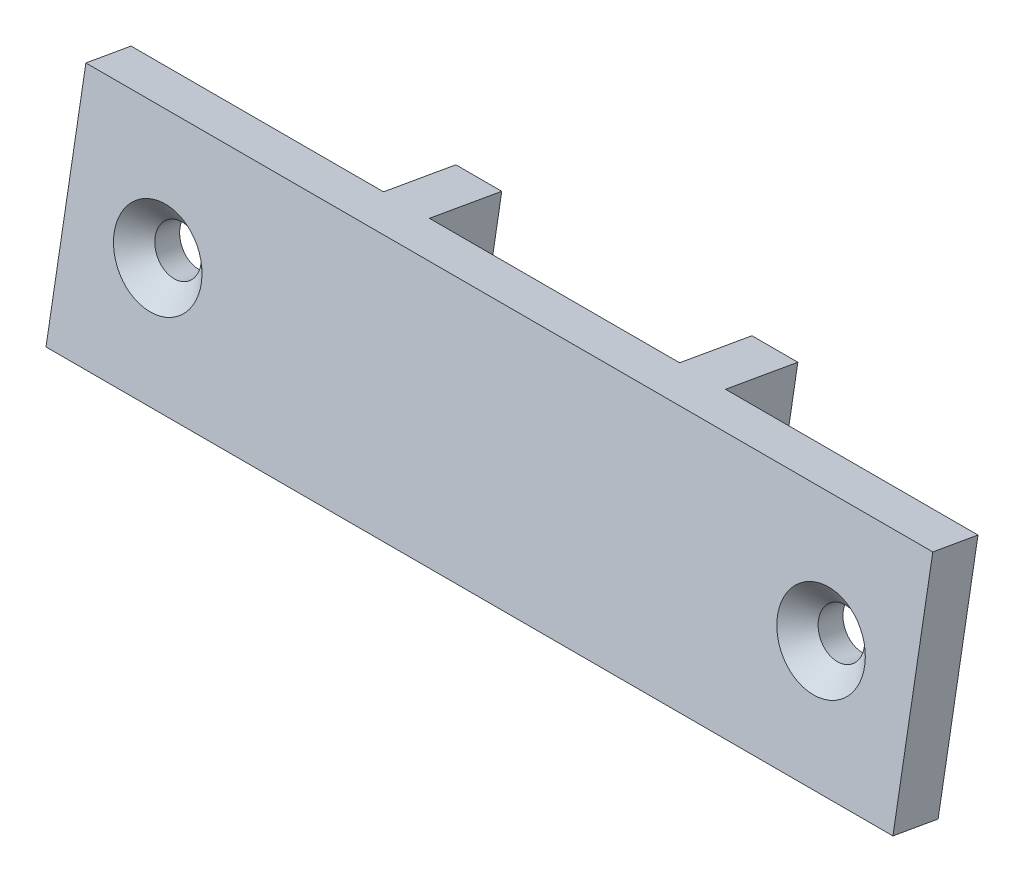
ISO-10303-21;
HEADER;
FILE_DESCRIPTION(('STEP AP214'),'2;1');
FILE_NAME('part.step','',(''),(''),'','','');
FILE_SCHEMA(('AUTOMOTIVE_DESIGN { 1 0 10303 214 1 1 1 1 }'));
ENDSEC;
DATA;
#1=APPLICATION_CONTEXT('core data for automotive mechanical design processes');
#2=APPLICATION_PROTOCOL_DEFINITION('international standard','automotive_design',2000,#1);
#3=PRODUCT_CONTEXT('',#1,'mechanical');
#4=PRODUCT('Part','Part','',(#3));
#5=PRODUCT_RELATED_PRODUCT_CATEGORY('part','',(#4));
#6=PRODUCT_DEFINITION_FORMATION('','',#4);
#7=PRODUCT_DEFINITION_CONTEXT('part definition',#1,'design');
#8=PRODUCT_DEFINITION('design','',#6,#7);
#9=PRODUCT_DEFINITION_SHAPE('','',#8);
#10=(LENGTH_UNIT() NAMED_UNIT(*) SI_UNIT(.MILLI.,.METRE.));
#11=(NAMED_UNIT(*) PLANE_ANGLE_UNIT() SI_UNIT($,.RADIAN.));
#12=(NAMED_UNIT(*) SI_UNIT($,.STERADIAN.) SOLID_ANGLE_UNIT());
#13=UNCERTAINTY_MEASURE_WITH_UNIT(LENGTH_MEASURE(1.E-05),#10,'distance_accuracy_value','');
#14=(GEOMETRIC_REPRESENTATION_CONTEXT(3) GLOBAL_UNCERTAINTY_ASSIGNED_CONTEXT((#13)) GLOBAL_UNIT_ASSIGNED_CONTEXT((#10,
#11,#12)) REPRESENTATION_CONTEXT('',''));
#15=CARTESIAN_POINT('',(0.,0.,0.));
#16=DIRECTION('',(0.,0.,1.));
#17=DIRECTION('',(1.,0.,0.));
#18=AXIS2_PLACEMENT_3D('',#15,#16,#17);
#19=CARTESIAN_POINT('',(0.,-1.36313819468535,-7.73074086114584));
#20=DIRECTION('',(0.,0.173648177666923,0.984807753012209));
#21=DIRECTION('',(0.,-0.984807753012209,0.173648177666923));
#22=AXIS2_PLACEMENT_3D('',#19,#20,#21);
#23=PLANE('',#22);
#24=CARTESIAN_POINT('',(14.45,-9.6355233199879,-6.27209616874369));
#25=DIRECTION('',(0.,0.173648177666923,0.984807753012209));
#26=DIRECTION('',(0.,-0.984807753012209,0.173648177666923));
#27=AXIS2_PLACEMENT_3D('',#24,#25,#26);
#28=CIRCLE('',#27,1.);
#29=CARTESIAN_POINT('',(14.45,-10.6203310730001,-6.09844799107677));
#30=VERTEX_POINT('',#29);
#31=EDGE_CURVE('E197',#30,#30,#28,.T.);
#32=ORIENTED_EDGE('',*,*,#31,.T.);
#33=EDGE_LOOP('',(#32));
#34=FACE_BOUND('',#33,.T.);
#35=DIRECTION('',(0.,-0.984807753012209,0.173648177666923));
#36=VECTOR('',#35,1.);
#37=CARTESIAN_POINT('',(7.45,-4.71148455492685,-7.14033705707831));
#38=LINE('',#37,#36);
#39=CARTESIAN_POINT('',(7.45,-4.71148455492685,-7.14033705707831));
#40=VERTEX_POINT('',#39);
#41=CARTESIAN_POINT('',(7.45,-14.5595620850489,-5.40385528040907));
#42=VERTEX_POINT('',#41);
#43=EDGE_CURVE('E162',#40,#42,#38,.T.);
#44=ORIENTED_EDGE('',*,*,#43,.F.);
#45=DIRECTION('',(-1.,0.,0.));
#46=VECTOR('',#45,1.);
#47=CARTESIAN_POINT('',(-18.45,-4.71148455492685,-7.14033705707831));
#48=LINE('',#47,#46);
#49=CARTESIAN_POINT('',(18.45,-4.71148455492685,-7.14033705707831));
#50=VERTEX_POINT('',#49);
#51=EDGE_CURVE('E214',#50,#40,#48,.T.);
#52=ORIENTED_EDGE('',*,*,#51,.F.);
#53=DIRECTION('',(0.,0.984807753012209,-0.173648177666923));
#54=VECTOR('',#53,1.);
#55=CARTESIAN_POINT('',(18.45,-4.71148455492685,-7.14033705707831));
#56=LINE('',#55,#54);
#57=CARTESIAN_POINT('',(18.45,-14.5595620850489,-5.40385528040907));
#58=VERTEX_POINT('',#57);
#59=EDGE_CURVE('E209',#58,#50,#56,.T.);
#60=ORIENTED_EDGE('',*,*,#59,.F.);
#61=DIRECTION('',(1.,0.,0.));
#62=VECTOR('',#61,1.);
#63=CARTESIAN_POINT('',(-18.45,-14.5595620850489,-5.40385528040907));
#64=LINE('',#63,#62);
#65=EDGE_CURVE('E57',#42,#58,#64,.T.);
#66=ORIENTED_EDGE('',*,*,#65,.F.);
#67=EDGE_LOOP('',(#44,#52,#60,#66));
#68=FACE_BOUND('',#67,.T.);
#69=ADVANCED_FACE('F41',(#34,#68),#23,.F.);
#70=DIRECTION('',(0.,0.984807753012209,-0.173648177666923));
#71=VECTOR('',#70,1.);
#72=CARTESIAN_POINT('',(5.45,-4.71148455492685,-7.14033705707831));
#73=LINE('',#72,#71);
#74=CARTESIAN_POINT('',(5.45,-14.5595620850489,-5.40385528040907));
#75=VERTEX_POINT('',#74);
#76=CARTESIAN_POINT('',(5.45,-4.71148455492685,-7.14033705707831));
#77=VERTEX_POINT('',#76);
#78=EDGE_CURVE('E65',#75,#77,#73,.T.);
#79=ORIENTED_EDGE('',*,*,#78,.F.);
#80=CARTESIAN_POINT('',(-5.45,-14.559562085049,-5.40385528040908));
#81=VERTEX_POINT('',#80);
#82=EDGE_CURVE('E210',#81,#75,#64,.T.);
#83=ORIENTED_EDGE('',*,*,#82,.F.);
#84=DIRECTION('',(0.,-0.984807753012209,0.173648177666923));
#85=VECTOR('',#84,1.);
#86=CARTESIAN_POINT('',(-5.45,-14.559562085049,-5.40385528040908));
#87=LINE('',#86,#85);
#88=CARTESIAN_POINT('',(-5.45,-4.71148455492685,-7.14033705707831));
#89=VERTEX_POINT('',#88);
#90=EDGE_CURVE('E178',#89,#81,#87,.T.);
#91=ORIENTED_EDGE('',*,*,#90,.F.);
#92=EDGE_CURVE('E216',#77,#89,#48,.T.);
#93=ORIENTED_EDGE('',*,*,#92,.F.);
#94=EDGE_LOOP('',(#79,#83,#91,#93));
#95=FACE_BOUND('',#94,.T.);
#96=ADVANCED_FACE('F255',(#95),#23,.F.);
#97=CARTESIAN_POINT('',(-14.45,-9.6355233199879,-6.27209616874369));
#98=DIRECTION('',(0.,0.173648177666923,0.984807753012209));
#99=DIRECTION('',(0.,-0.984807753012209,0.173648177666923));
#100=AXIS2_PLACEMENT_3D('',#97,#98,#99);
#101=CIRCLE('',#100,1.);
#102=CARTESIAN_POINT('',(-14.45,-10.6203310730001,-6.09844799107677));
#103=VERTEX_POINT('',#102);
#104=EDGE_CURVE('E278',#103,#103,#101,.F.);
#105=ORIENTED_EDGE('',*,*,#104,.F.);
#106=EDGE_LOOP('',(#105));
#107=FACE_BOUND('',#106,.T.);
#108=DIRECTION('',(0.,0.984807753012209,-0.173648177666923));
#109=VECTOR('',#108,1.);
#110=CARTESIAN_POINT('',(-7.45,-14.559562085049,-5.40385528040908));
#111=LINE('',#110,#109);
#112=CARTESIAN_POINT('',(-7.45,-14.5595620850489,-5.40385528040907));
#113=VERTEX_POINT('',#112);
#114=CARTESIAN_POINT('',(-7.45,-4.71148455492685,-7.14033705707831));
#115=VERTEX_POINT('',#114);
#116=EDGE_CURVE('E174',#113,#115,#111,.T.);
#117=ORIENTED_EDGE('',*,*,#116,.F.);
#118=CARTESIAN_POINT('',(-18.45,-14.5595620850489,-5.40385528040907));
#119=VERTEX_POINT('',#118);
#120=EDGE_CURVE('E206',#119,#113,#64,.T.);
#121=ORIENTED_EDGE('',*,*,#120,.F.);
#122=DIRECTION('',(0.,-0.984807753012209,0.173648177666923));
#123=VECTOR('',#122,1.);
#124=CARTESIAN_POINT('',(-18.45,-4.71148455492685,-7.14033705707831));
#125=LINE('',#124,#123);
#126=CARTESIAN_POINT('',(-18.45,-4.71148455492685,-7.14033705707831));
#127=VERTEX_POINT('',#126);
#128=EDGE_CURVE('E202',#127,#119,#125,.T.);
#129=ORIENTED_EDGE('',*,*,#128,.F.);
#130=EDGE_CURVE('E213',#115,#127,#48,.T.);
#131=ORIENTED_EDGE('',*,*,#130,.F.);
#132=EDGE_LOOP('',(#117,#121,#129,#131));
#133=FACE_BOUND('',#132,.T.);
#134=ADVANCED_FACE('F258',(#107,#133),#23,.F.);
#135=CARTESIAN_POINT('',(-18.45,-4.71148455492685,-7.14033705707831));
#136=DIRECTION('',(-1.,0.,0.));
#137=DIRECTION('',(0.,0.,1.));
#138=AXIS2_PLACEMENT_3D('',#135,#136,#137);
#139=PLANE('',#138);
#140=DIRECTION('',(0.,-0.984807753012209,0.173648177666923));
#141=VECTOR('',#140,1.);
#142=CARTESIAN_POINT('',(-18.45,-4.36418819959301,-5.17072155105389));
#143=LINE('',#142,#141);
#144=CARTESIAN_POINT('',(-18.45,-4.36418819959301,-5.17072155105389));
#145=VERTEX_POINT('',#144);
#146=CARTESIAN_POINT('',(-18.45,-14.2122657297151,-3.43423977438465));
#147=VERTEX_POINT('',#146);
#148=EDGE_CURVE('E155',#145,#147,#143,.T.);
#149=ORIENTED_EDGE('',*,*,#148,.F.);
#150=DIRECTION('',(0.,0.173648177666923,0.984807753012209));
#151=VECTOR('',#150,1.);
#152=CARTESIAN_POINT('',(-18.45,-4.71148455492685,-7.14033705707831));
#153=LINE('',#152,#151);
#154=EDGE_CURVE('E225',#127,#145,#153,.T.);
#155=ORIENTED_EDGE('',*,*,#154,.F.);
#156=ORIENTED_EDGE('',*,*,#128,.T.);
#157=DIRECTION('',(0.,0.173648177666923,0.984807753012209));
#158=VECTOR('',#157,1.);
#159=CARTESIAN_POINT('',(-18.45,-14.5595620850489,-5.40385528040907));
#160=LINE('',#159,#158);
#161=EDGE_CURVE('E215',#119,#147,#160,.T.);
#162=ORIENTED_EDGE('',*,*,#161,.T.);
#163=EDGE_LOOP('',(#149,#155,#156,#162));
#164=FACE_BOUND('',#163,.T.);
#165=ADVANCED_FACE('F267',(#164),#139,.T.);
#166=CARTESIAN_POINT('',(-18.45,-4.71148455492685,-7.14033705707831));
#167=DIRECTION('',(0.,0.984807753012209,-0.173648177666923));
#168=DIRECTION('',(0.,0.173648177666923,0.984807753012209));
#169=AXIS2_PLACEMENT_3D('',#166,#167,#168);
#170=PLANE('',#169);
#171=DIRECTION('',(-1.,0.,0.));
#172=VECTOR('',#171,1.);
#173=CARTESIAN_POINT('',(-18.45,-4.36418819959301,-5.17072155105389));
#174=LINE('',#173,#172);
#175=CARTESIAN_POINT('',(18.45,-4.36418819959301,-5.17072155105389));
#176=VERTEX_POINT('',#175);
#177=EDGE_CURVE('E205',#176,#145,#174,.T.);
#178=ORIENTED_EDGE('',*,*,#177,.F.);
#179=DIRECTION('',(0.,0.173648177666923,0.984807753012209));
#180=VECTOR('',#179,1.);
#181=CARTESIAN_POINT('',(18.45,-4.71148455492685,-7.14033705707831));
#182=LINE('',#181,#180);
#183=EDGE_CURVE('E228',#50,#176,#182,.T.);
#184=ORIENTED_EDGE('',*,*,#183,.F.);
#185=ORIENTED_EDGE('',*,*,#51,.T.);
#186=DIRECTION('',(0.,0.173648177666923,0.984807753012209));
#187=VECTOR('',#186,1.);
#188=CARTESIAN_POINT('',(7.45,-7.29850188280833,-21.8120413957292));
#189=LINE('',#188,#187);
#190=CARTESIAN_POINT('',(7.45,-5.26715872346101,-10.2917218667174));
#191=VERTEX_POINT('',#190);
#192=EDGE_CURVE('E146',#191,#40,#189,.T.);
#193=ORIENTED_EDGE('',*,*,#192,.F.);
#194=DIRECTION('',(1.,0.,0.));
#195=VECTOR('',#194,1.);
#196=CARTESIAN_POINT('',(7.45,-5.26715872346101,-10.2917218667174));
#197=LINE('',#196,#195);
#198=CARTESIAN_POINT('',(5.45,-5.26715872346101,-10.2917218667174));
#199=VERTEX_POINT('',#198);
#200=EDGE_CURVE('E139',#199,#191,#197,.T.);
#201=ORIENTED_EDGE('',*,*,#200,.F.);
#202=DIRECTION('',(0.,0.173648177666923,0.984807753012209));
#203=VECTOR('',#202,1.);
#204=CARTESIAN_POINT('',(5.45,-7.29850188280834,-21.8120413957292));
#205=LINE('',#204,#203);
#206=EDGE_CURVE('E130',#199,#77,#205,.T.);
#207=ORIENTED_EDGE('',*,*,#206,.T.);
#208=ORIENTED_EDGE('',*,*,#92,.T.);
#209=DIRECTION('',(0.,0.173648177666923,0.984807753012209));
#210=VECTOR('',#209,1.);
#211=CARTESIAN_POINT('',(-5.45,-7.29850188280834,-21.8120413957292));
#212=LINE('',#211,#210);
#213=CARTESIAN_POINT('',(-5.45,-5.26715872346101,-10.2917218667174));
#214=VERTEX_POINT('',#213);
#215=EDGE_CURVE('E180',#214,#89,#212,.T.);
#216=ORIENTED_EDGE('',*,*,#215,.F.);
#217=DIRECTION('',(1.,0.,0.));
#218=VECTOR('',#217,1.);
#219=CARTESIAN_POINT('',(-7.45,-5.26715872346101,-10.2917218667174));
#220=LINE('',#219,#218);
#221=CARTESIAN_POINT('',(-7.45,-5.26715872346101,-10.2917218667174));
#222=VERTEX_POINT('',#221);
#223=EDGE_CURVE('E191',#222,#214,#220,.T.);
#224=ORIENTED_EDGE('',*,*,#223,.F.);
#225=DIRECTION('',(0.,0.173648177666923,0.984807753012209));
#226=VECTOR('',#225,1.);
#227=CARTESIAN_POINT('',(-7.45,-7.29850188280833,-21.8120413957292));
#228=LINE('',#227,#226);
#229=EDGE_CURVE('E183',#222,#115,#228,.T.);
#230=ORIENTED_EDGE('',*,*,#229,.T.);
#231=ORIENTED_EDGE('',*,*,#130,.T.);
#232=ORIENTED_EDGE('',*,*,#154,.T.);
#233=EDGE_LOOP('',(#178,#184,#185,#193,#201,#207,#208,#216,#224,#230,#231,#232));
#234=FACE_BOUND('',#233,.T.);
#235=ADVANCED_FACE('F143',(#234),#170,.T.);
#236=CARTESIAN_POINT('',(18.45,-4.71148455492685,-7.14033705707831));
#237=DIRECTION('',(1.,0.,0.));
#238=DIRECTION('',(0.,0.,-1.));
#239=AXIS2_PLACEMENT_3D('',#236,#237,#238);
#240=PLANE('',#239);
#241=DIRECTION('',(0.,0.984807753012209,-0.173648177666923));
#242=VECTOR('',#241,1.);
#243=CARTESIAN_POINT('',(18.45,-4.36418819959301,-5.17072155105389));
#244=LINE('',#243,#242);
#245=CARTESIAN_POINT('',(18.45,-14.2122657297151,-3.43423977438465));
#246=VERTEX_POINT('',#245);
#247=EDGE_CURVE('E220',#246,#176,#244,.T.);
#248=ORIENTED_EDGE('',*,*,#247,.F.);
#249=DIRECTION('',(0.,0.173648177666923,0.984807753012209));
#250=VECTOR('',#249,1.);
#251=CARTESIAN_POINT('',(18.45,-14.5595620850489,-5.40385528040907));
#252=LINE('',#251,#250);
#253=EDGE_CURVE('E230',#58,#246,#252,.T.);
#254=ORIENTED_EDGE('',*,*,#253,.F.);
#255=ORIENTED_EDGE('',*,*,#59,.T.);
#256=ORIENTED_EDGE('',*,*,#183,.T.);
#257=EDGE_LOOP('',(#248,#254,#255,#256));
#258=FACE_BOUND('',#257,.T.);
#259=ADVANCED_FACE('F301',(#258),#240,.T.);
#260=CARTESIAN_POINT('',(-18.45,-14.5595620850489,-5.40385528040907));
#261=DIRECTION('',(0.,-0.984807753012209,0.173648177666923));
#262=DIRECTION('',(0.,-0.173648177666923,-0.984807753012209));
#263=AXIS2_PLACEMENT_3D('',#260,#261,#262);
#264=PLANE('',#263);
#265=DIRECTION('',(1.,0.,0.));
#266=VECTOR('',#265,1.);
#267=CARTESIAN_POINT('',(-18.45,-14.2122657297151,-3.43423977438465));
#268=LINE('',#267,#266);
#269=EDGE_CURVE('E158',#147,#246,#268,.T.);
#270=ORIENTED_EDGE('',*,*,#269,.F.);
#271=ORIENTED_EDGE('',*,*,#161,.F.);
#272=ORIENTED_EDGE('',*,*,#120,.T.);
#273=DIRECTION('',(0.,0.173648177666923,0.984807753012209));
#274=VECTOR('',#273,1.);
#275=CARTESIAN_POINT('',(-7.45,-17.1465794129304,-20.0755596190599));
#276=LINE('',#275,#274);
#277=CARTESIAN_POINT('',(-7.45,-15.1152362535831,-8.55524009004817));
#278=VERTEX_POINT('',#277);
#279=EDGE_CURVE('E171',#278,#113,#276,.T.);
#280=ORIENTED_EDGE('',*,*,#279,.F.);
#281=DIRECTION('',(-1.,0.,0.));
#282=VECTOR('',#281,1.);
#283=CARTESIAN_POINT('',(-7.45,-15.1152362535831,-8.55524009004817));
#284=LINE('',#283,#282);
#285=CARTESIAN_POINT('',(-5.45,-15.1152362535831,-8.55524009004817));
#286=VERTEX_POINT('',#285);
#287=EDGE_CURVE('E179',#286,#278,#284,.T.);
#288=ORIENTED_EDGE('',*,*,#287,.F.);
#289=DIRECTION('',(0.,0.173648177666923,0.984807753012209));
#290=VECTOR('',#289,1.);
#291=CARTESIAN_POINT('',(-5.45,-17.1465794129304,-20.0755596190599));
#292=LINE('',#291,#290);
#293=EDGE_CURVE('E175',#286,#81,#292,.T.);
#294=ORIENTED_EDGE('',*,*,#293,.T.);
#295=ORIENTED_EDGE('',*,*,#82,.T.);
#296=DIRECTION('',(0.,0.173648177666923,0.984807753012209));
#297=VECTOR('',#296,1.);
#298=CARTESIAN_POINT('',(5.45,-17.1465794129304,-20.0755596190599));
#299=LINE('',#298,#297);
#300=CARTESIAN_POINT('',(5.45,-15.1152362535831,-8.55524009004817));
#301=VERTEX_POINT('',#300);
#302=EDGE_CURVE('E168',#301,#75,#299,.T.);
#303=ORIENTED_EDGE('',*,*,#302,.F.);
#304=DIRECTION('',(-1.,0.,0.));
#305=VECTOR('',#304,1.);
#306=CARTESIAN_POINT('',(7.45,-15.1152362535831,-8.55524009004817));
#307=LINE('',#306,#305);
#308=CARTESIAN_POINT('',(7.45,-15.1152362535831,-8.55524009004817));
#309=VERTEX_POINT('',#308);
#310=EDGE_CURVE('E154',#309,#301,#307,.T.);
#311=ORIENTED_EDGE('',*,*,#310,.F.);
#312=DIRECTION('',(0.,0.173648177666923,0.984807753012209));
#313=VECTOR('',#312,1.);
#314=CARTESIAN_POINT('',(7.45,-17.1465794129304,-20.0755596190599));
#315=LINE('',#314,#313);
#316=EDGE_CURVE('E166',#309,#42,#315,.T.);
#317=ORIENTED_EDGE('',*,*,#316,.T.);
#318=ORIENTED_EDGE('',*,*,#65,.T.);
#319=ORIENTED_EDGE('',*,*,#253,.T.);
#320=EDGE_LOOP('',(#270,#271,#272,#280,#288,#294,#295,#303,#311,#317,#318,#319));
#321=FACE_BOUND('',#320,.T.);
#322=ADVANCED_FACE('F285',(#321),#264,.T.);
#323=CARTESIAN_POINT('',(0.,-1.0158418393515,-5.76112535512143));
#324=DIRECTION('',(0.,0.173648177666923,0.984807753012209));
#325=DIRECTION('',(0.,-0.984807753012209,0.173648177666923));
#326=AXIS2_PLACEMENT_3D('',#323,#324,#325);
#327=PLANE('',#326);
#328=CARTESIAN_POINT('',(-14.45,-9.28822696465405,-4.30248066271927));
#329=DIRECTION('',(0.,0.173648177666923,0.984807753012209));
#330=DIRECTION('',(0.,-0.984807753012209,0.173648177666923));
#331=AXIS2_PLACEMENT_3D('',#328,#329,#330);
#332=CIRCLE('',#331,1.90000000000002);
#333=CARTESIAN_POINT('',(-14.45,-11.1593616953773,-3.97254912515211));
#334=VERTEX_POINT('',#333);
#335=EDGE_CURVE('E50',#334,#334,#332,.F.);
#336=ORIENTED_EDGE('',*,*,#335,.T.);
#337=EDGE_LOOP('',(#336));
#338=FACE_BOUND('',#337,.T.);
#339=CARTESIAN_POINT('',(14.45,-9.28822696465405,-4.30248066271927));
#340=DIRECTION('',(0.,0.173648177666923,0.984807753012209));
#341=DIRECTION('',(0.,-0.984807753012209,0.173648177666923));
#342=AXIS2_PLACEMENT_3D('',#339,#340,#341);
#343=CIRCLE('',#342,1.90000000000001);
#344=CARTESIAN_POINT('',(14.45,-11.1593616953773,-3.97254912515211));
#345=VERTEX_POINT('',#344);
#346=EDGE_CURVE('E235',#345,#345,#343,.F.);
#347=ORIENTED_EDGE('',*,*,#346,.T.);
#348=EDGE_LOOP('',(#347));
#349=FACE_BOUND('',#348,.T.);
#350=ORIENTED_EDGE('',*,*,#148,.T.);
#351=ORIENTED_EDGE('',*,*,#269,.T.);
#352=ORIENTED_EDGE('',*,*,#247,.T.);
#353=ORIENTED_EDGE('',*,*,#177,.T.);
#354=EDGE_LOOP('',(#350,#351,#352,#353));
#355=FACE_BOUND('',#354,.T.);
#356=ADVANCED_FACE('F240',(#338,#349,#355),#327,.T.);
#357=CARTESIAN_POINT('',(-7.45,-17.1465794129304,-20.0755596190599));
#358=DIRECTION('',(1.,0.,0.));
#359=DIRECTION('',(0.,1.,0.));
#360=AXIS2_PLACEMENT_3D('',#357,#358,#359);
#361=PLANE('',#360);
#362=DIRECTION('',(0.,0.984807753012209,-0.173648177666923));
#363=VECTOR('',#362,1.);
#364=CARTESIAN_POINT('',(-7.45,-15.1152362535831,-8.55524009004817));
#365=LINE('',#364,#363);
#366=EDGE_CURVE('E188',#278,#222,#365,.T.);
#367=ORIENTED_EDGE('',*,*,#366,.F.);
#368=ORIENTED_EDGE('',*,*,#279,.T.);
#369=ORIENTED_EDGE('',*,*,#116,.T.);
#370=ORIENTED_EDGE('',*,*,#229,.F.);
#371=EDGE_LOOP('',(#367,#368,#369,#370));
#372=FACE_BOUND('',#371,.T.);
#373=ADVANCED_FACE('F288',(#372),#361,.F.);
#374=CARTESIAN_POINT('',(-5.45,-17.1465794129304,-20.0755596190599));
#375=DIRECTION('',(-1.,0.,0.));
#376=DIRECTION('',(0.,-1.,0.));
#377=AXIS2_PLACEMENT_3D('',#374,#375,#376);
#378=PLANE('',#377);
#379=DIRECTION('',(0.,-0.984807753012209,0.173648177666923));
#380=VECTOR('',#379,1.);
#381=CARTESIAN_POINT('',(-5.45,-15.1152362535831,-8.55524009004817));
#382=LINE('',#381,#380);
#383=EDGE_CURVE('E194',#214,#286,#382,.T.);
#384=ORIENTED_EDGE('',*,*,#383,.F.);
#385=ORIENTED_EDGE('',*,*,#215,.T.);
#386=ORIENTED_EDGE('',*,*,#90,.T.);
#387=ORIENTED_EDGE('',*,*,#293,.F.);
#388=EDGE_LOOP('',(#384,#385,#386,#387));
#389=FACE_BOUND('',#388,.T.);
#390=ADVANCED_FACE('F292',(#389),#378,.F.);
#391=CARTESIAN_POINT('',(-10.45,-20.186996181596,-7.66095197506352));
#392=DIRECTION('',(0.,-0.173648177666923,-0.984807753012209));
#393=DIRECTION('',(0.,0.984807753012209,-0.173648177666923));
#394=AXIS2_PLACEMENT_3D('',#391,#392,#393);
#395=PLANE('',#394);
#396=ORIENTED_EDGE('',*,*,#287,.T.);
#397=ORIENTED_EDGE('',*,*,#366,.T.);
#398=ORIENTED_EDGE('',*,*,#223,.T.);
#399=ORIENTED_EDGE('',*,*,#383,.T.);
#400=EDGE_LOOP('',(#396,#397,#398,#399));
#401=FACE_BOUND('',#400,.T.);
#402=ADVANCED_FACE('F290',(#401),#395,.T.);
#403=CARTESIAN_POINT('',(7.45,-7.29850188280833,-21.8120413957292));
#404=DIRECTION('',(-1.,0.,0.));
#405=DIRECTION('',(0.,-1.,0.));
#406=AXIS2_PLACEMENT_3D('',#403,#404,#405);
#407=PLANE('',#406);
#408=DIRECTION('',(0.,-0.984807753012209,0.173648177666923));
#409=VECTOR('',#408,1.);
#410=CARTESIAN_POINT('',(7.45,-5.26715872346102,-10.2917218667174));
#411=LINE('',#410,#409);
#412=EDGE_CURVE('E150',#191,#309,#411,.T.);
#413=ORIENTED_EDGE('',*,*,#412,.F.);
#414=ORIENTED_EDGE('',*,*,#192,.T.);
#415=ORIENTED_EDGE('',*,*,#43,.T.);
#416=ORIENTED_EDGE('',*,*,#316,.F.);
#417=EDGE_LOOP('',(#413,#414,#415,#416));
#418=FACE_BOUND('',#417,.T.);
#419=ADVANCED_FACE('F305',(#418),#407,.F.);
#420=CARTESIAN_POINT('',(5.45,-7.29850188280834,-21.8120413957292));
#421=DIRECTION('',(1.,0.,0.));
#422=DIRECTION('',(0.,1.,0.));
#423=AXIS2_PLACEMENT_3D('',#420,#421,#422);
#424=PLANE('',#423);
#425=DIRECTION('',(0.,0.984807753012209,-0.173648177666923));
#426=VECTOR('',#425,1.);
#427=CARTESIAN_POINT('',(5.45,-5.26715872346102,-10.2917218667174));
#428=LINE('',#427,#426);
#429=EDGE_CURVE('E135',#301,#199,#428,.T.);
#430=ORIENTED_EDGE('',*,*,#429,.F.);
#431=ORIENTED_EDGE('',*,*,#302,.T.);
#432=ORIENTED_EDGE('',*,*,#78,.T.);
#433=ORIENTED_EDGE('',*,*,#206,.F.);
#434=EDGE_LOOP('',(#430,#431,#432,#433));
#435=FACE_BOUND('',#434,.T.);
#436=ADVANCED_FACE('F132',(#435),#424,.F.);
#437=CARTESIAN_POINT('',(-10.45,-20.186996181596,-7.66095197506352));
#438=DIRECTION('',(0.,-0.173648177666923,-0.984807753012209));
#439=DIRECTION('',(0.,0.984807753012209,-0.173648177666923));
#440=AXIS2_PLACEMENT_3D('',#437,#438,#439);
#441=PLANE('',#440);
#442=ORIENTED_EDGE('',*,*,#200,.T.);
#443=ORIENTED_EDGE('',*,*,#412,.T.);
#444=ORIENTED_EDGE('',*,*,#310,.T.);
#445=ORIENTED_EDGE('',*,*,#429,.T.);
#446=EDGE_LOOP('',(#442,#443,#444,#445));
#447=FACE_BOUND('',#446,.T.);
#448=ADVANCED_FACE('F153',(#447),#441,.T.);
#449=CARTESIAN_POINT('',(14.45,-20.5421766674875,-68.1268010112933));
#450=DIRECTION('',(0.,0.173648177666923,0.984807753012209));
#451=DIRECTION('',(0.,-0.984807753012209,0.173648177666923));
#452=AXIS2_PLACEMENT_3D('',#449,#450,#451);
#453=CYLINDRICAL_SURFACE('',#452,1.);
#454=CARTESIAN_POINT('',(14.45,-9.44451032455428,-5.18880764043025));
#455=DIRECTION('',(0.,0.173648177666923,0.984807753012209));
#456=DIRECTION('',(0.,-0.984807753012209,0.173648177666923));
#457=AXIS2_PLACEMENT_3D('',#454,#455,#456);
#458=CIRCLE('',#457,1.);
#459=CARTESIAN_POINT('',(14.45,-10.4293180775665,-5.01515946276333));
#460=VERTEX_POINT('',#459);
#461=EDGE_CURVE('E227',#460,#460,#458,.T.);
#462=ORIENTED_EDGE('',*,*,#461,.T.);
#463=EDGE_LOOP('',(#462));
#464=FACE_BOUND('',#463,.T.);
#465=ORIENTED_EDGE('',*,*,#31,.F.);
#466=EDGE_LOOP('',(#465));
#467=FACE_BOUND('',#466,.T.);
#468=ADVANCED_FACE('F318',(#464,#467),#453,.F.);
#469=CARTESIAN_POINT('',(14.45,-9.44451032455428,-5.18880764043027));
#470=DIRECTION('',(0.,0.173648177666923,0.984807753012209));
#471=DIRECTION('',(0.,-0.984807753012209,0.173648177666923));
#472=AXIS2_PLACEMENT_3D('',#469,#470,#471);
#473=CONICAL_SURFACE('',#472,1.,0.785398163397449);
#474=ORIENTED_EDGE('',*,*,#346,.F.);
#475=EDGE_LOOP('',(#474));
#476=FACE_BOUND('',#475,.T.);
#477=ORIENTED_EDGE('',*,*,#461,.F.);
#478=EDGE_LOOP('',(#477));
#479=FACE_BOUND('',#478,.T.);
#480=ADVANCED_FACE('F250',(#476,#479),#473,.F.);
#481=CARTESIAN_POINT('',(-14.45,-10.4881533615915,-11.10760142255));
#482=DIRECTION('',(0.,0.173648177666923,0.984807753012209));
#483=DIRECTION('',(0.,-0.984807753012209,0.173648177666923));
#484=AXIS2_PLACEMENT_3D('',#481,#482,#483);
#485=CYLINDRICAL_SURFACE('',#484,1.);
#486=CARTESIAN_POINT('',(-14.45,-9.44451032455429,-5.18880764043026));
#487=DIRECTION('',(0.,0.173648177666922,0.98480775301221));
#488=DIRECTION('',(0.,-0.98480775301221,0.173648177666922));
#489=AXIS2_PLACEMENT_3D('',#486,#487,#488);
#490=CIRCLE('',#489,1.);
#491=CARTESIAN_POINT('',(-14.45,-10.4293180775665,-5.01515946276334));
#492=VERTEX_POINT('',#491);
#493=EDGE_CURVE('E11',#492,#492,#490,.T.);
#494=ORIENTED_EDGE('',*,*,#493,.T.);
#495=EDGE_LOOP('',(#494));
#496=FACE_BOUND('',#495,.T.);
#497=ORIENTED_EDGE('',*,*,#104,.T.);
#498=EDGE_LOOP('',(#497));
#499=FACE_BOUND('',#498,.T.);
#500=ADVANCED_FACE('F244',(#496,#499),#485,.F.);
#501=CARTESIAN_POINT('',(-14.45,-9.28822696465405,-4.30248066271927));
#502=DIRECTION('',(0.,0.173648177666922,0.98480775301221));
#503=DIRECTION('',(0.,-0.98480775301221,0.173648177666922));
#504=AXIS2_PLACEMENT_3D('',#501,#502,#503);
#505=CONICAL_SURFACE('',#504,1.90000000000002,0.785398163397454);
#506=ORIENTED_EDGE('',*,*,#493,.F.);
#507=EDGE_LOOP('',(#506));
#508=FACE_BOUND('',#507,.T.);
#509=ORIENTED_EDGE('',*,*,#335,.F.);
#510=EDGE_LOOP('',(#509));
#511=FACE_BOUND('',#510,.T.);
#512=ADVANCED_FACE('F44',(#508,#511),#505,.F.);
#513=CLOSED_SHELL('',(#69,#96,#134,#165,#235,#259,#322,#356,#373,#390,#402,#419,#436,#448,#468,
#480,#500,#512));
#514=MANIFOLD_SOLID_BREP('B2',#513);
#515=ADVANCED_BREP_SHAPE_REPRESENTATION('',(#18,#514),#14);
#516=SHAPE_DEFINITION_REPRESENTATION(#9,#515);
ENDSEC;
END-ISO-10303-21;
